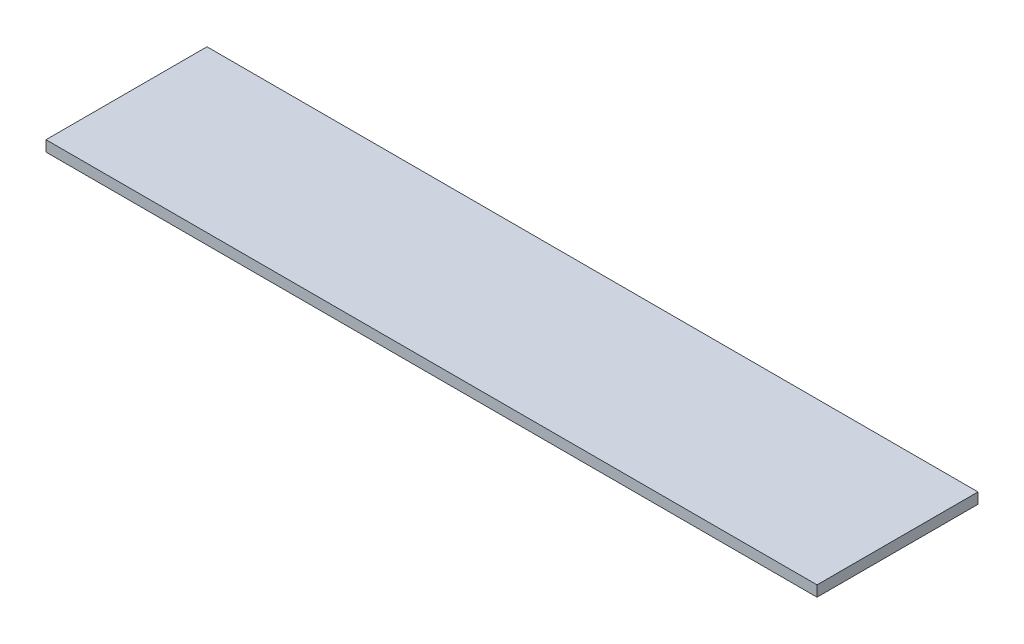
ISO-10303-21;
HEADER;
FILE_DESCRIPTION(('STEP AP214'),'2;1');
FILE_NAME('part.step','',(''),(''),'','','');
FILE_SCHEMA(('AUTOMOTIVE_DESIGN { 1 0 10303 214 1 1 1 1 }'));
ENDSEC;
DATA;
#1=APPLICATION_CONTEXT('core data for automotive mechanical design processes');
#2=APPLICATION_PROTOCOL_DEFINITION('international standard','automotive_design',2000,#1);
#3=PRODUCT_CONTEXT('',#1,'mechanical');
#4=PRODUCT('Part','Part','',(#3));
#5=PRODUCT_RELATED_PRODUCT_CATEGORY('part','',(#4));
#6=PRODUCT_DEFINITION_FORMATION('','',#4);
#7=PRODUCT_DEFINITION_CONTEXT('part definition',#1,'design');
#8=PRODUCT_DEFINITION('design','',#6,#7);
#9=PRODUCT_DEFINITION_SHAPE('','',#8);
#10=(LENGTH_UNIT() NAMED_UNIT(*) SI_UNIT(.MILLI.,.METRE.));
#11=(NAMED_UNIT(*) PLANE_ANGLE_UNIT() SI_UNIT($,.RADIAN.));
#12=(NAMED_UNIT(*) SI_UNIT($,.STERADIAN.) SOLID_ANGLE_UNIT());
#13=UNCERTAINTY_MEASURE_WITH_UNIT(LENGTH_MEASURE(1.E-05),#10,'distance_accuracy_value','');
#14=(GEOMETRIC_REPRESENTATION_CONTEXT(3) GLOBAL_UNCERTAINTY_ASSIGNED_CONTEXT((#13)) GLOBAL_UNIT_ASSIGNED_CONTEXT((#10,
#11,#12)) REPRESENTATION_CONTEXT('',''));
#15=CARTESIAN_POINT('',(0.,0.,0.));
#16=DIRECTION('',(0.,0.,1.));
#17=DIRECTION('',(1.,0.,0.));
#18=AXIS2_PLACEMENT_3D('',#15,#16,#17);
#19=CARTESIAN_POINT('',(-23.2513791578247,16.,0.));
#20=DIRECTION('',(0.,0.,-1.));
#21=DIRECTION('',(0.,-1.,0.));
#22=AXIS2_PLACEMENT_3D('',#19,#20,#21);
#23=PLANE('',#22);
#24=DIRECTION('',(1.,0.,0.));
#25=VECTOR('',#24,1.);
#26=CARTESIAN_POINT('',(-30.7513791578247,0.,0.));
#27=LINE('',#26,#25);
#28=CARTESIAN_POINT('',(-46.6075736480171,0.,0.));
#29=VERTEX_POINT('',#28);
#30=CARTESIAN_POINT('',(25.237556561086,0.,0.));
#31=VERTEX_POINT('',#30);
#32=EDGE_CURVE('E78',#29,#31,#27,.T.);
#33=ORIENTED_EDGE('',*,*,#32,.T.);
#34=DIRECTION('',(0.,-1.,0.));
#35=VECTOR('',#34,1.);
#36=CARTESIAN_POINT('',(25.237556561086,0.,0.));
#37=LINE('',#36,#35);
#38=CARTESIAN_POINT('',(25.237556561086,-1.,0.));
#39=VERTEX_POINT('',#38);
#40=EDGE_CURVE('E104',#31,#39,#37,.T.);
#41=ORIENTED_EDGE('',*,*,#40,.T.);
#42=DIRECTION('',(1.,0.,0.));
#43=VECTOR('',#42,1.);
#44=CARTESIAN_POINT('',(-30.7513791578247,-1.00000000000001,0.));
#45=LINE('',#44,#43);
#46=CARTESIAN_POINT('',(-46.6075736480171,-1.,0.));
#47=VERTEX_POINT('',#46);
#48=EDGE_CURVE('E51',#47,#39,#45,.T.);
#49=ORIENTED_EDGE('',*,*,#48,.F.);
#50=DIRECTION('',(0.,1.,0.));
#51=VECTOR('',#50,1.);
#52=CARTESIAN_POINT('',(-46.6075736480171,-1.,0.));
#53=LINE('',#52,#51);
#54=EDGE_CURVE('E113',#47,#29,#53,.T.);
#55=ORIENTED_EDGE('',*,*,#54,.T.);
#56=EDGE_LOOP('',(#33,#41,#49,#55));
#57=FACE_BOUND('',#56,.T.);
#58=ADVANCED_FACE('F47',(#57),#23,.T.);
#59=CARTESIAN_POINT('',(-29.7513791578247,-2.00000000000001,15.));
#60=DIRECTION('',(0.,0.,1.));
#61=DIRECTION('',(0.,1.,0.));
#62=AXIS2_PLACEMENT_3D('',#59,#60,#61);
#63=PLANE('',#62);
#64=DIRECTION('',(1.,0.,0.));
#65=VECTOR('',#64,1.);
#66=CARTESIAN_POINT('',(-30.7513791578247,0.,15.));
#67=LINE('',#66,#65);
#68=CARTESIAN_POINT('',(-46.6075736480171,0.,15.));
#69=VERTEX_POINT('',#68);
#70=CARTESIAN_POINT('',(25.237556561086,0.,15.));
#71=VERTEX_POINT('',#70);
#72=EDGE_CURVE('E57',#69,#71,#67,.T.);
#73=ORIENTED_EDGE('',*,*,#72,.F.);
#74=DIRECTION('',(0.,1.,0.));
#75=VECTOR('',#74,1.);
#76=CARTESIAN_POINT('',(-46.6075736480171,-1.,15.));
#77=LINE('',#76,#75);
#78=CARTESIAN_POINT('',(-46.6075736480171,-1.,15.));
#79=VERTEX_POINT('',#78);
#80=EDGE_CURVE('E116',#79,#69,#77,.T.);
#81=ORIENTED_EDGE('',*,*,#80,.F.);
#82=DIRECTION('',(1.,0.,0.));
#83=VECTOR('',#82,1.);
#84=CARTESIAN_POINT('',(-30.7513791578247,-1.00000000000001,15.));
#85=LINE('',#84,#83);
#86=CARTESIAN_POINT('',(25.237556561086,-1.,15.));
#87=VERTEX_POINT('',#86);
#88=EDGE_CURVE('E12',#79,#87,#85,.T.);
#89=ORIENTED_EDGE('',*,*,#88,.T.);
#90=DIRECTION('',(0.,-1.,0.));
#91=VECTOR('',#90,1.);
#92=CARTESIAN_POINT('',(25.237556561086,0.,15.));
#93=LINE('',#92,#91);
#94=EDGE_CURVE('E103',#71,#87,#93,.T.);
#95=ORIENTED_EDGE('',*,*,#94,.F.);
#96=EDGE_LOOP('',(#73,#81,#89,#95));
#97=FACE_BOUND('',#96,.T.);
#98=ADVANCED_FACE('F107',(#97),#63,.T.);
#99=CARTESIAN_POINT('',(7.73755656108598,0.,15.));
#100=DIRECTION('',(0.,1.,0.));
#101=DIRECTION('',(0.,0.,1.));
#102=AXIS2_PLACEMENT_3D('',#99,#100,#101);
#103=PLANE('',#102);
#104=ORIENTED_EDGE('',*,*,#32,.F.);
#105=DIRECTION('',(0.,0.,-1.));
#106=VECTOR('',#105,1.);
#107=CARTESIAN_POINT('',(-46.6075736480171,0.,15.));
#108=LINE('',#107,#106);
#109=EDGE_CURVE('E97',#69,#29,#108,.T.);
#110=ORIENTED_EDGE('',*,*,#109,.F.);
#111=ORIENTED_EDGE('',*,*,#72,.T.);
#112=DIRECTION('',(0.,0.,-1.));
#113=VECTOR('',#112,1.);
#114=CARTESIAN_POINT('',(25.237556561086,0.,15.));
#115=LINE('',#114,#113);
#116=EDGE_CURVE('E95',#71,#31,#115,.T.);
#117=ORIENTED_EDGE('',*,*,#116,.T.);
#118=EDGE_LOOP('',(#104,#110,#111,#117));
#119=FACE_BOUND('',#118,.T.);
#120=ADVANCED_FACE('F49',(#119),#103,.T.);
#121=CARTESIAN_POINT('',(-30.7513791578247,-1.00000000000001,15.));
#122=DIRECTION('',(0.,1.,0.));
#123=DIRECTION('',(-1.,0.,0.));
#124=AXIS2_PLACEMENT_3D('',#121,#122,#123);
#125=PLANE('',#124);
#126=ORIENTED_EDGE('',*,*,#48,.T.);
#127=DIRECTION('',(0.,0.,-1.));
#128=VECTOR('',#127,1.);
#129=CARTESIAN_POINT('',(25.237556561086,-1.,15.));
#130=LINE('',#129,#128);
#131=EDGE_CURVE('E105',#87,#39,#130,.T.);
#132=ORIENTED_EDGE('',*,*,#131,.F.);
#133=ORIENTED_EDGE('',*,*,#88,.F.);
#134=DIRECTION('',(0.,0.,-1.));
#135=VECTOR('',#134,1.);
#136=CARTESIAN_POINT('',(-46.6075736480171,-1.,15.));
#137=LINE('',#136,#135);
#138=EDGE_CURVE('E111',#79,#47,#137,.T.);
#139=ORIENTED_EDGE('',*,*,#138,.T.);
#140=EDGE_LOOP('',(#126,#132,#133,#139));
#141=FACE_BOUND('',#140,.T.);
#142=ADVANCED_FACE('F120',(#141),#125,.F.);
#143=CARTESIAN_POINT('',(-46.6075736480171,-1.,15.));
#144=DIRECTION('',(-1.,0.,0.));
#145=DIRECTION('',(0.,0.,1.));
#146=AXIS2_PLACEMENT_3D('',#143,#144,#145);
#147=PLANE('',#146);
#148=ORIENTED_EDGE('',*,*,#54,.F.);
#149=ORIENTED_EDGE('',*,*,#138,.F.);
#150=ORIENTED_EDGE('',*,*,#80,.T.);
#151=ORIENTED_EDGE('',*,*,#109,.T.);
#152=EDGE_LOOP('',(#148,#149,#150,#151));
#153=FACE_BOUND('',#152,.T.);
#154=ADVANCED_FACE('F119',(#153),#147,.T.);
#155=CARTESIAN_POINT('',(25.237556561086,0.,15.));
#156=DIRECTION('',(1.,0.,0.));
#157=DIRECTION('',(0.,1.,0.));
#158=AXIS2_PLACEMENT_3D('',#155,#156,#157);
#159=PLANE('',#158);
#160=ORIENTED_EDGE('',*,*,#40,.F.);
#161=ORIENTED_EDGE('',*,*,#116,.F.);
#162=ORIENTED_EDGE('',*,*,#94,.T.);
#163=ORIENTED_EDGE('',*,*,#131,.T.);
#164=EDGE_LOOP('',(#160,#161,#162,#163));
#165=FACE_BOUND('',#164,.T.);
#166=ADVANCED_FACE('F102',(#165),#159,.T.);
#167=CLOSED_SHELL('',(#58,#98,#120,#142,#154,#166));
#168=MANIFOLD_SOLID_BREP('B2',#167);
#169=ADVANCED_BREP_SHAPE_REPRESENTATION('',(#18,#168),#14);
#170=SHAPE_DEFINITION_REPRESENTATION(#9,#169);
ENDSEC;
END-ISO-10303-21;
